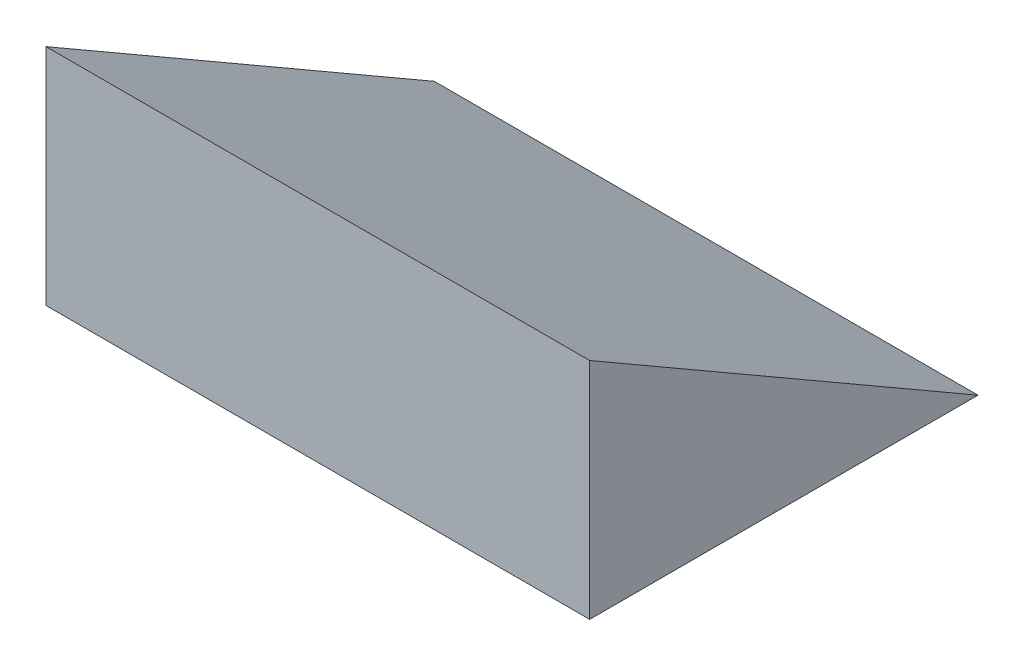
ISO-10303-21;
HEADER;
FILE_DESCRIPTION(('STEP AP214'),'2;1');
FILE_NAME('part.step','',(''),(''),'','','');
FILE_SCHEMA(('AUTOMOTIVE_DESIGN { 1 0 10303 214 1 1 1 1 }'));
ENDSEC;
DATA;
#1=APPLICATION_CONTEXT('core data for automotive mechanical design processes');
#2=APPLICATION_PROTOCOL_DEFINITION('international standard','automotive_design',2000,#1);
#3=PRODUCT_CONTEXT('',#1,'mechanical');
#4=PRODUCT('Part','Part','',(#3));
#5=PRODUCT_RELATED_PRODUCT_CATEGORY('part','',(#4));
#6=PRODUCT_DEFINITION_FORMATION('','',#4);
#7=PRODUCT_DEFINITION_CONTEXT('part definition',#1,'design');
#8=PRODUCT_DEFINITION('design','',#6,#7);
#9=PRODUCT_DEFINITION_SHAPE('','',#8);
#10=(LENGTH_UNIT() NAMED_UNIT(*) SI_UNIT(.MILLI.,.METRE.));
#11=(NAMED_UNIT(*) PLANE_ANGLE_UNIT() SI_UNIT($,.RADIAN.));
#12=(NAMED_UNIT(*) SI_UNIT($,.STERADIAN.) SOLID_ANGLE_UNIT());
#13=UNCERTAINTY_MEASURE_WITH_UNIT(LENGTH_MEASURE(1.E-05),#10,'distance_accuracy_value','');
#14=(GEOMETRIC_REPRESENTATION_CONTEXT(3) GLOBAL_UNCERTAINTY_ASSIGNED_CONTEXT((#13)) GLOBAL_UNIT_ASSIGNED_CONTEXT((#10,
#11,#12)) REPRESENTATION_CONTEXT('',''));
#15=CARTESIAN_POINT('',(0.,0.,0.));
#16=DIRECTION('',(0.,0.,1.));
#17=DIRECTION('',(1.,0.,0.));
#18=AXIS2_PLACEMENT_3D('',#15,#16,#17);
#19=CARTESIAN_POINT('',(14.,5.77350269189618,0.));
#20=DIRECTION('',(0.,0.,-1.));
#21=DIRECTION('',(0.,1.,0.));
#22=AXIS2_PLACEMENT_3D('',#19,#20,#21);
#23=PLANE('',#22);
#24=DIRECTION('',(0.,-1.,0.));
#25=VECTOR('',#24,1.);
#26=CARTESIAN_POINT('',(0.,5.77350269189618,0.));
#27=LINE('',#26,#25);
#28=CARTESIAN_POINT('',(0.,5.77350269189618,0.));
#29=VERTEX_POINT('',#28);
#30=CARTESIAN_POINT('',(0.,0.,0.));
#31=VERTEX_POINT('',#30);
#32=EDGE_CURVE('E80',#29,#31,#27,.T.);
#33=ORIENTED_EDGE('',*,*,#32,.T.);
#34=DIRECTION('',(-1.,0.,0.));
#35=VECTOR('',#34,1.);
#36=CARTESIAN_POINT('',(14.,0.,0.));
#37=LINE('',#36,#35);
#38=CARTESIAN_POINT('',(14.,0.,0.));
#39=VERTEX_POINT('',#38);
#40=EDGE_CURVE('E11',#39,#31,#37,.T.);
#41=ORIENTED_EDGE('',*,*,#40,.F.);
#42=DIRECTION('',(0.,-1.,0.));
#43=VECTOR('',#42,1.);
#44=CARTESIAN_POINT('',(14.,5.77350269189618,0.));
#45=LINE('',#44,#43);
#46=CARTESIAN_POINT('',(14.,5.77350269189618,0.));
#47=VERTEX_POINT('',#46);
#48=EDGE_CURVE('E73',#47,#39,#45,.T.);
#49=ORIENTED_EDGE('',*,*,#48,.F.);
#50=DIRECTION('',(-1.,0.,0.));
#51=VECTOR('',#50,1.);
#52=CARTESIAN_POINT('',(14.,5.77350269189618,0.));
#53=LINE('',#52,#51);
#54=EDGE_CURVE('E81',#47,#29,#53,.T.);
#55=ORIENTED_EDGE('',*,*,#54,.T.);
#56=EDGE_LOOP('',(#33,#41,#49,#55));
#57=FACE_BOUND('',#56,.T.);
#58=ADVANCED_FACE('F33',(#57),#23,.F.);
#59=CARTESIAN_POINT('',(14.,0.,0.));
#60=DIRECTION('',(0.,1.,0.));
#61=DIRECTION('',(0.,0.,1.));
#62=AXIS2_PLACEMENT_3D('',#59,#60,#61);
#63=PLANE('',#62);
#64=DIRECTION('',(0.,0.,-1.));
#65=VECTOR('',#64,1.);
#66=CARTESIAN_POINT('',(0.,0.,0.));
#67=LINE('',#66,#65);
#68=CARTESIAN_POINT('',(0.,0.,-10.));
#69=VERTEX_POINT('',#68);
#70=EDGE_CURVE('E61',#31,#69,#67,.T.);
#71=ORIENTED_EDGE('',*,*,#70,.T.);
#72=DIRECTION('',(-1.,0.,0.));
#73=VECTOR('',#72,1.);
#74=CARTESIAN_POINT('',(14.,0.,-10.));
#75=LINE('',#74,#73);
#76=CARTESIAN_POINT('',(14.,0.,-10.));
#77=VERTEX_POINT('',#76);
#78=EDGE_CURVE('E41',#77,#69,#75,.T.);
#79=ORIENTED_EDGE('',*,*,#78,.F.);
#80=DIRECTION('',(0.,0.,-1.));
#81=VECTOR('',#80,1.);
#82=CARTESIAN_POINT('',(14.,0.,0.));
#83=LINE('',#82,#81);
#84=EDGE_CURVE('E69',#39,#77,#83,.T.);
#85=ORIENTED_EDGE('',*,*,#84,.F.);
#86=ORIENTED_EDGE('',*,*,#40,.T.);
#87=EDGE_LOOP('',(#71,#79,#85,#86));
#88=FACE_BOUND('',#87,.T.);
#89=ADVANCED_FACE('F70',(#88),#63,.F.);
#90=CARTESIAN_POINT('',(14.,0.,-10.));
#91=DIRECTION('',(0.,-0.866025403784442,0.499999999999995));
#92=DIRECTION('',(0.,-0.499999999999995,-0.866025403784442));
#93=AXIS2_PLACEMENT_3D('',#90,#91,#92);
#94=PLANE('',#93);
#95=DIRECTION('',(0.,0.499999999999995,0.866025403784442));
#96=VECTOR('',#95,1.);
#97=CARTESIAN_POINT('',(0.,0.,-10.));
#98=LINE('',#97,#96);
#99=EDGE_CURVE('E66',#69,#29,#98,.T.);
#100=ORIENTED_EDGE('',*,*,#99,.T.);
#101=ORIENTED_EDGE('',*,*,#54,.F.);
#102=DIRECTION('',(0.,0.499999999999995,0.866025403784442));
#103=VECTOR('',#102,1.);
#104=CARTESIAN_POINT('',(14.,0.,-10.));
#105=LINE('',#104,#103);
#106=EDGE_CURVE('E49',#77,#47,#105,.T.);
#107=ORIENTED_EDGE('',*,*,#106,.F.);
#108=ORIENTED_EDGE('',*,*,#78,.T.);
#109=EDGE_LOOP('',(#100,#101,#107,#108));
#110=FACE_BOUND('',#109,.T.);
#111=ADVANCED_FACE('F88',(#110),#94,.F.);
#112=CARTESIAN_POINT('',(14.,0.,0.));
#113=DIRECTION('',(1.,0.,0.));
#114=DIRECTION('',(0.,0.,-1.));
#115=AXIS2_PLACEMENT_3D('',#112,#113,#114);
#116=PLANE('',#115);
#117=ORIENTED_EDGE('',*,*,#48,.T.);
#118=ORIENTED_EDGE('',*,*,#84,.T.);
#119=ORIENTED_EDGE('',*,*,#106,.T.);
#120=EDGE_LOOP('',(#117,#118,#119));
#121=FACE_BOUND('',#120,.T.);
#122=ADVANCED_FACE('F76',(#121),#116,.T.);
#123=CARTESIAN_POINT('',(0.,0.,0.));
#124=DIRECTION('',(1.,0.,0.));
#125=DIRECTION('',(0.,0.,-1.));
#126=AXIS2_PLACEMENT_3D('',#123,#124,#125);
#127=PLANE('',#126);
#128=ORIENTED_EDGE('',*,*,#32,.F.);
#129=ORIENTED_EDGE('',*,*,#99,.F.);
#130=ORIENTED_EDGE('',*,*,#70,.F.);
#131=EDGE_LOOP('',(#128,#129,#130));
#132=FACE_BOUND('',#131,.T.);
#133=ADVANCED_FACE('F89',(#132),#127,.F.);
#134=CLOSED_SHELL('',(#58,#89,#111,#122,#133));
#135=MANIFOLD_SOLID_BREP('B2',#134);
#136=ADVANCED_BREP_SHAPE_REPRESENTATION('',(#18,#135),#14);
#137=SHAPE_DEFINITION_REPRESENTATION(#9,#136);
ENDSEC;
END-ISO-10303-21;
